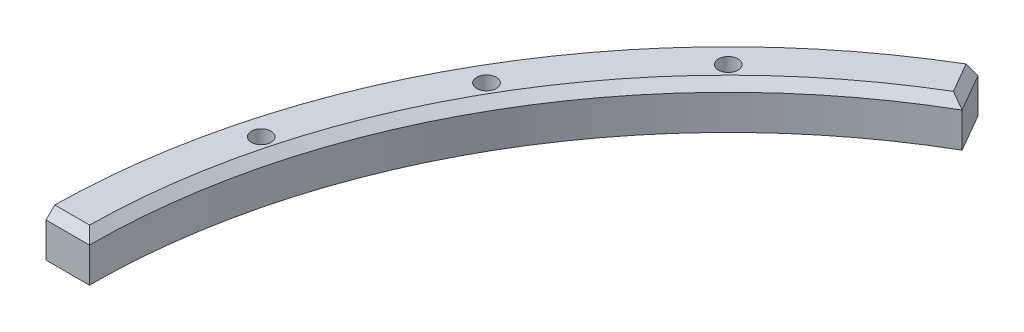
ISO-10303-21;
HEADER;
FILE_DESCRIPTION(('STEP AP214'),'2;1');
FILE_NAME('part.step','',(''),(''),'','','');
FILE_SCHEMA(('AUTOMOTIVE_DESIGN { 1 0 10303 214 1 1 1 1 }'));
ENDSEC;
DATA;
#1=APPLICATION_CONTEXT('core data for automotive mechanical design processes');
#2=APPLICATION_PROTOCOL_DEFINITION('international standard','automotive_design',2000,#1);
#3=PRODUCT_CONTEXT('',#1,'mechanical');
#4=PRODUCT('Part','Part','',(#3));
#5=PRODUCT_RELATED_PRODUCT_CATEGORY('part','',(#4));
#6=PRODUCT_DEFINITION_FORMATION('','',#4);
#7=PRODUCT_DEFINITION_CONTEXT('part definition',#1,'design');
#8=PRODUCT_DEFINITION('design','',#6,#7);
#9=PRODUCT_DEFINITION_SHAPE('','',#8);
#10=(LENGTH_UNIT() NAMED_UNIT(*) SI_UNIT(.MILLI.,.METRE.));
#11=(NAMED_UNIT(*) PLANE_ANGLE_UNIT() SI_UNIT($,.RADIAN.));
#12=(NAMED_UNIT(*) SI_UNIT($,.STERADIAN.) SOLID_ANGLE_UNIT());
#13=UNCERTAINTY_MEASURE_WITH_UNIT(LENGTH_MEASURE(1.E-05),#10,'distance_accuracy_value','');
#14=(GEOMETRIC_REPRESENTATION_CONTEXT(3) GLOBAL_UNCERTAINTY_ASSIGNED_CONTEXT((#13)) GLOBAL_UNIT_ASSIGNED_CONTEXT((#10,
#11,#12)) REPRESENTATION_CONTEXT('',''));
#15=CARTESIAN_POINT('',(0.,0.,0.));
#16=DIRECTION('',(0.,0.,1.));
#17=DIRECTION('',(1.,0.,0.));
#18=AXIS2_PLACEMENT_3D('',#15,#16,#17);
#19=CARTESIAN_POINT('',(0.,10.,0.));
#20=DIRECTION('',(-0.86602540378444,0.,0.499999999999998));
#21=DIRECTION('',(0.499999999999998,0.,0.86602540378444));
#22=AXIS2_PLACEMENT_3D('',#19,#20,#21);
#23=PLANE('',#22);
#24=DIRECTION('',(0.,-1.,0.));
#25=VECTOR('',#24,1.);
#26=CARTESIAN_POINT('',(-78.4999999999997,10.,-135.965988394157));
#27=LINE('',#26,#25);
#28=CARTESIAN_POINT('',(-78.4999999999997,7.99999999999999,-135.965988394157));
#29=VERTEX_POINT('',#28);
#30=CARTESIAN_POINT('',(-78.4999999999997,0.,-135.965988394157));
#31=VERTEX_POINT('',#30);
#32=EDGE_CURVE('E103',#29,#31,#27,.T.);
#33=ORIENTED_EDGE('',*,*,#32,.F.);
#34=DIRECTION('',(0.499999999999998,0.,0.86602540378444));
#35=VECTOR('',#34,1.);
#36=CARTESIAN_POINT('',(-73.4999999999997,7.99999999999999,-127.305734356313));
#37=LINE('',#36,#35);
#38=CARTESIAN_POINT('',(-73.4999999999997,7.99999999999998,-127.305734356313));
#39=VERTEX_POINT('',#38);
#40=EDGE_CURVE('E74',#29,#39,#37,.T.);
#41=ORIENTED_EDGE('',*,*,#40,.T.);
#42=DIRECTION('',(0.,-1.,0.));
#43=VECTOR('',#42,1.);
#44=CARTESIAN_POINT('',(-73.4999999999997,10.,-127.305734356313));
#45=LINE('',#44,#43);
#46=CARTESIAN_POINT('',(-73.4999999999997,0.,-127.305734356313));
#47=VERTEX_POINT('',#46);
#48=EDGE_CURVE('E124',#39,#47,#45,.T.);
#49=ORIENTED_EDGE('',*,*,#48,.T.);
#50=DIRECTION('',(-0.499999999999998,0.,-0.86602540378444));
#51=VECTOR('',#50,1.);
#52=CARTESIAN_POINT('',(0.,0.,0.));
#53=LINE('',#52,#51);
#54=EDGE_CURVE('E119',#47,#31,#53,.T.);
#55=ORIENTED_EDGE('',*,*,#54,.T.);
#56=EDGE_LOOP('',(#33,#41,#49,#55));
#57=FACE_BOUND('',#56,.T.);
#58=ADVANCED_FACE('F43',(#57),#23,.F.);
#59=CARTESIAN_POINT('',(0.,10.,0.));
#60=DIRECTION('',(0.,-1.,0.));
#61=DIRECTION('',(0.,0.,-1.));
#62=AXIS2_PLACEMENT_3D('',#59,#60,#61);
#63=CYLINDRICAL_SURFACE('',#62,157.);
#64=CARTESIAN_POINT('',(0.,10.,0.));
#65=DIRECTION('',(0.,1.,0.));
#66=DIRECTION('',(0.,0.,1.));
#67=AXIS2_PLACEMENT_3D('',#64,#65,#66);
#68=CIRCLE('',#67,157.);
#69=CARTESIAN_POINT('',(-80.225681122391,10.,-134.954955775801));
#70=VERTEX_POINT('',#69);
#71=CARTESIAN_POINT('',(-156.987260629645,10.,-2.00000000000002));
#72=VERTEX_POINT('',#71);
#73=EDGE_CURVE('E131',#70,#72,#68,.T.);
#74=ORIENTED_EDGE('',*,*,#73,.F.);
#75=CARTESIAN_POINT('',(0.,7.99999999999998,0.));
#76=DIRECTION('',(0.612372435695793,0.70710678118655,-0.353553390593271));
#77=DIRECTION('',(0.612372435695797,-0.707106781186545,-0.353553390593274));
#78=AXIS2_PLACEMENT_3D('',#75,#76,#77);
#79=ELLIPSE('',#78,222.031529292575,157.);
#80=EDGE_CURVE('E110',#70,#29,#79,.F.);
#81=ORIENTED_EDGE('',*,*,#80,.T.);
#82=ORIENTED_EDGE('',*,*,#32,.T.);
#83=CARTESIAN_POINT('',(0.,0.,0.));
#84=DIRECTION('',(0.,1.,0.));
#85=DIRECTION('',(0.,0.,1.));
#86=AXIS2_PLACEMENT_3D('',#83,#84,#85);
#87=CIRCLE('',#86,157.);
#88=CARTESIAN_POINT('',(-157.,0.,0.));
#89=VERTEX_POINT('',#88);
#90=EDGE_CURVE('E108',#31,#89,#87,.T.);
#91=ORIENTED_EDGE('',*,*,#90,.T.);
#92=DIRECTION('',(0.,-1.,0.));
#93=VECTOR('',#92,1.);
#94=CARTESIAN_POINT('',(-157.,10.,0.));
#95=LINE('',#94,#93);
#96=CARTESIAN_POINT('',(-157.,7.99999999999998,0.));
#97=VERTEX_POINT('',#96);
#98=EDGE_CURVE('E113',#97,#89,#95,.T.);
#99=ORIENTED_EDGE('',*,*,#98,.F.);
#100=CARTESIAN_POINT('',(0.,7.99999999999998,0.));
#101=DIRECTION('',(0.,-0.707106781186547,-0.707106781186547));
#102=DIRECTION('',(0.,-0.707106781186548,0.707106781186548));
#103=AXIS2_PLACEMENT_3D('',#100,#101,#102);
#104=ELLIPSE('',#103,222.031529292576,157.);
#105=EDGE_CURVE('E147',#97,#72,#104,.T.);
#106=ORIENTED_EDGE('',*,*,#105,.T.);
#107=EDGE_LOOP('',(#74,#81,#82,#91,#99,#106));
#108=FACE_BOUND('',#107,.T.);
#109=ADVANCED_FACE('F106',(#108),#63,.T.);
#110=CARTESIAN_POINT('',(0.,10.,0.));
#111=DIRECTION('',(0.,0.,1.));
#112=DIRECTION('',(1.,0.,0.));
#113=AXIS2_PLACEMENT_3D('',#110,#111,#112);
#114=PLANE('',#113);
#115=DIRECTION('',(0.,-1.,0.));
#116=VECTOR('',#115,1.);
#117=CARTESIAN_POINT('',(-147.,10.,0.));
#118=LINE('',#117,#116);
#119=CARTESIAN_POINT('',(-147.,7.99999999999998,0.));
#120=VERTEX_POINT('',#119);
#121=CARTESIAN_POINT('',(-147.,0.,0.));
#122=VERTEX_POINT('',#121);
#123=EDGE_CURVE('E138',#120,#122,#118,.T.);
#124=ORIENTED_EDGE('',*,*,#123,.F.);
#125=DIRECTION('',(-1.,0.,0.));
#126=VECTOR('',#125,1.);
#127=CARTESIAN_POINT('',(0.,7.99999999999998,0.));
#128=LINE('',#127,#126);
#129=EDGE_CURVE('E11',#120,#97,#128,.T.);
#130=ORIENTED_EDGE('',*,*,#129,.T.);
#131=ORIENTED_EDGE('',*,*,#98,.T.);
#132=DIRECTION('',(-1.,0.,0.));
#133=VECTOR('',#132,1.);
#134=CARTESIAN_POINT('',(0.,0.,0.));
#135=LINE('',#134,#133);
#136=EDGE_CURVE('E122',#122,#89,#135,.T.);
#137=ORIENTED_EDGE('',*,*,#136,.F.);
#138=EDGE_LOOP('',(#124,#130,#131,#137));
#139=FACE_BOUND('',#138,.T.);
#140=ADVANCED_FACE('F177',(#139),#114,.T.);
#141=CARTESIAN_POINT('',(0.,10.,0.));
#142=DIRECTION('',(0.,-1.,0.));
#143=DIRECTION('',(0.,0.,-1.));
#144=AXIS2_PLACEMENT_3D('',#141,#142,#143);
#145=CYLINDRICAL_SURFACE('',#144,147.);
#146=ORIENTED_EDGE('',*,*,#48,.F.);
#147=CARTESIAN_POINT('',(0.,7.99999999999998,0.));
#148=DIRECTION('',(0.,1.,0.));
#149=DIRECTION('',(0.,0.,1.));
#150=AXIS2_PLACEMENT_3D('',#147,#148,#149);
#151=CIRCLE('',#150,147.);
#152=EDGE_CURVE('E59',#39,#120,#151,.T.);
#153=ORIENTED_EDGE('',*,*,#152,.T.);
#154=ORIENTED_EDGE('',*,*,#123,.T.);
#155=CARTESIAN_POINT('',(0.,0.,0.));
#156=DIRECTION('',(0.,1.,0.));
#157=DIRECTION('',(0.,0.,1.));
#158=AXIS2_PLACEMENT_3D('',#155,#156,#157);
#159=CIRCLE('',#158,147.);
#160=EDGE_CURVE('E135',#47,#122,#159,.T.);
#161=ORIENTED_EDGE('',*,*,#160,.F.);
#162=EDGE_LOOP('',(#146,#153,#154,#161));
#163=FACE_BOUND('',#162,.T.);
#164=ADVANCED_FACE('F182',(#163),#145,.F.);
#165=CARTESIAN_POINT('',(0.,10.,0.));
#166=DIRECTION('',(0.,1.,0.));
#167=DIRECTION('',(0.,0.,1.));
#168=AXIS2_PLACEMENT_3D('',#165,#166,#167);
#169=PLANE('',#168);
#170=CARTESIAN_POINT('',(-131.635861375235,10.,-76.0000000000002));
#171=DIRECTION('',(0.,1.,0.));
#172=DIRECTION('',(-0.258819045102521,0.,0.965925826289068));
#173=AXIS2_PLACEMENT_3D('',#170,#171,#172);
#174=CIRCLE('',#173,2.25000000000001);
#175=CARTESIAN_POINT('',(-132.218204226715,10.,-73.8266668908497));
#176=VERTEX_POINT('',#175);
#177=EDGE_CURVE('E213',#176,#176,#174,.T.);
#178=ORIENTED_EDGE('',*,*,#177,.F.);
#179=EDGE_LOOP('',(#178));
#180=FACE_BOUND('',#179,.T.);
#181=CARTESIAN_POINT('',(-107.480230740355,10.,-107.480230740355));
#182=DIRECTION('',(0.,1.,0.));
#183=DIRECTION('',(-0.500000000000001,0.,0.866025403784438));
#184=AXIS2_PLACEMENT_3D('',#181,#182,#183);
#185=CIRCLE('',#184,2.25000000000001);
#186=CARTESIAN_POINT('',(-108.605230740355,10.,-105.53167358184));
#187=VERTEX_POINT('',#186);
#188=EDGE_CURVE('E218',#187,#187,#185,.T.);
#189=ORIENTED_EDGE('',*,*,#188,.F.);
#190=EDGE_LOOP('',(#189));
#191=FACE_BOUND('',#190,.T.);
#192=CARTESIAN_POINT('',(-146.820725595938,10.,-39.3404948555832));
#193=DIRECTION('',(0.,1.,0.));
#194=DIRECTION('',(0.,0.,1.));
#195=AXIS2_PLACEMENT_3D('',#192,#193,#194);
#196=CIRCLE('',#195,2.25000000000001);
#197=CARTESIAN_POINT('',(-146.820725595938,10.,-37.0904948555832));
#198=VERTEX_POINT('',#197);
#199=EDGE_CURVE('E128',#198,#198,#196,.T.);
#200=ORIENTED_EDGE('',*,*,#199,.F.);
#201=EDGE_LOOP('',(#200));
#202=FACE_BOUND('',#201,.T.);
#203=CARTESIAN_POINT('',(0.,10.,0.));
#204=DIRECTION('',(0.,1.,0.));
#205=DIRECTION('',(0.,0.,1.));
#206=AXIS2_PLACEMENT_3D('',#203,#204,#205);
#207=CIRCLE('',#206,149.);
#208=CARTESIAN_POINT('',(-148.986576576549,10.,-2.00000000000002));
#209=VERTEX_POINT('',#208);
#210=CARTESIAN_POINT('',(-76.2253390958433,10.,-128.026160138167));
#211=VERTEX_POINT('',#210);
#212=EDGE_CURVE('E142',#209,#211,#207,.F.);
#213=ORIENTED_EDGE('',*,*,#212,.T.);
#214=DIRECTION('',(-0.499999999999998,0.,-0.86602540378444));
#215=VECTOR('',#214,1.);
#216=CARTESIAN_POINT('',(-80.2320508075686,10.,-134.965988394157));
#217=LINE('',#216,#215);
#218=EDGE_CURVE('E144',#211,#70,#217,.T.);
#219=ORIENTED_EDGE('',*,*,#218,.T.);
#220=ORIENTED_EDGE('',*,*,#73,.T.);
#221=DIRECTION('',(1.,0.,0.));
#222=VECTOR('',#221,1.);
#223=CARTESIAN_POINT('',(0.,10.,-2.00000000000002));
#224=LINE('',#223,#222);
#225=EDGE_CURVE('E112',#72,#209,#224,.T.);
#226=ORIENTED_EDGE('',*,*,#225,.T.);
#227=EDGE_LOOP('',(#213,#219,#220,#226));
#228=FACE_BOUND('',#227,.T.);
#229=ADVANCED_FACE('F186',(#180,#191,#202,#228),#169,.T.);
#230=CARTESIAN_POINT('',(0.,0.,0.));
#231=DIRECTION('',(0.,1.,0.));
#232=DIRECTION('',(0.,0.,1.));
#233=AXIS2_PLACEMENT_3D('',#230,#231,#232);
#234=PLANE('',#233);
#235=CARTESIAN_POINT('',(-131.635861375235,0.,-76.0000000000002));
#236=DIRECTION('',(0.,1.,0.));
#237=DIRECTION('',(-0.258819045102521,0.,0.965925826289068));
#238=AXIS2_PLACEMENT_3D('',#235,#236,#237);
#239=CIRCLE('',#238,2.25000000000001);
#240=CARTESIAN_POINT('',(-132.218204226715,0.,-73.8266668908497));
#241=VERTEX_POINT('',#240);
#242=EDGE_CURVE('E210',#241,#241,#239,.T.);
#243=ORIENTED_EDGE('',*,*,#242,.T.);
#244=EDGE_LOOP('',(#243));
#245=FACE_BOUND('',#244,.T.);
#246=CARTESIAN_POINT('',(-107.480230740355,0.,-107.480230740355));
#247=DIRECTION('',(0.,1.,0.));
#248=DIRECTION('',(-0.500000000000001,0.,0.866025403784438));
#249=AXIS2_PLACEMENT_3D('',#246,#247,#248);
#250=CIRCLE('',#249,2.25000000000001);
#251=CARTESIAN_POINT('',(-108.605230740355,0.,-105.53167358184));
#252=VERTEX_POINT('',#251);
#253=EDGE_CURVE('E214',#252,#252,#250,.T.);
#254=ORIENTED_EDGE('',*,*,#253,.T.);
#255=EDGE_LOOP('',(#254));
#256=FACE_BOUND('',#255,.T.);
#257=CARTESIAN_POINT('',(-146.820725595938,0.,-39.3404948555832));
#258=DIRECTION('',(0.,1.,0.));
#259=DIRECTION('',(0.,0.,1.));
#260=AXIS2_PLACEMENT_3D('',#257,#258,#259);
#261=CIRCLE('',#260,2.25000000000001);
#262=CARTESIAN_POINT('',(-146.820725595938,0.,-37.0904948555832));
#263=VERTEX_POINT('',#262);
#264=EDGE_CURVE('E125',#263,#263,#261,.T.);
#265=ORIENTED_EDGE('',*,*,#264,.T.);
#266=EDGE_LOOP('',(#265));
#267=FACE_BOUND('',#266,.T.);
#268=ORIENTED_EDGE('',*,*,#54,.F.);
#269=ORIENTED_EDGE('',*,*,#160,.T.);
#270=ORIENTED_EDGE('',*,*,#136,.T.);
#271=ORIENTED_EDGE('',*,*,#90,.F.);
#272=EDGE_LOOP('',(#268,#269,#270,#271));
#273=FACE_BOUND('',#272,.T.);
#274=ADVANCED_FACE('F117',(#245,#256,#267,#273),#234,.F.);
#275=CARTESIAN_POINT('',(-146.820725595938,0.,-39.3404948555832));
#276=DIRECTION('',(0.,1.,0.));
#277=DIRECTION('',(0.,0.,1.));
#278=AXIS2_PLACEMENT_3D('',#275,#276,#277);
#279=CYLINDRICAL_SURFACE('',#278,2.25000000000001);
#280=ORIENTED_EDGE('',*,*,#264,.F.);
#281=EDGE_LOOP('',(#280));
#282=FACE_BOUND('',#281,.T.);
#283=ORIENTED_EDGE('',*,*,#199,.T.);
#284=EDGE_LOOP('',(#283));
#285=FACE_BOUND('',#284,.T.);
#286=ADVANCED_FACE('F189',(#282,#285),#279,.F.);
#287=CARTESIAN_POINT('',(-107.480230740355,0.,-107.480230740355));
#288=DIRECTION('',(0.,1.,0.));
#289=DIRECTION('',(0.,0.,1.));
#290=AXIS2_PLACEMENT_3D('',#287,#288,#289);
#291=CYLINDRICAL_SURFACE('',#290,2.25000000000001);
#292=ORIENTED_EDGE('',*,*,#253,.F.);
#293=EDGE_LOOP('',(#292));
#294=FACE_BOUND('',#293,.T.);
#295=ORIENTED_EDGE('',*,*,#188,.T.);
#296=EDGE_LOOP('',(#295));
#297=FACE_BOUND('',#296,.T.);
#298=ADVANCED_FACE('F196',(#294,#297),#291,.F.);
#299=CARTESIAN_POINT('',(-131.635861375235,0.,-76.0000000000002));
#300=DIRECTION('',(0.,1.,0.));
#301=DIRECTION('',(0.,0.,1.));
#302=AXIS2_PLACEMENT_3D('',#299,#300,#301);
#303=CYLINDRICAL_SURFACE('',#302,2.25000000000001);
#304=ORIENTED_EDGE('',*,*,#242,.F.);
#305=EDGE_LOOP('',(#304));
#306=FACE_BOUND('',#305,.T.);
#307=ORIENTED_EDGE('',*,*,#177,.T.);
#308=EDGE_LOOP('',(#307));
#309=FACE_BOUND('',#308,.T.);
#310=ADVANCED_FACE('F200',(#306,#309),#303,.F.);
#311=CARTESIAN_POINT('',(0.,7.99999999999998,0.));
#312=DIRECTION('',(0.,-0.707106781186547,-0.707106781186547));
#313=DIRECTION('',(-1.,0.,0.));
#314=AXIS2_PLACEMENT_3D('',#311,#312,#313);
#315=PLANE('',#314);
#316=ORIENTED_EDGE('',*,*,#105,.F.);
#317=ORIENTED_EDGE('',*,*,#129,.F.);
#318=CARTESIAN_POINT('',(-147.,7.99999999999998,0.));
#319=CARTESIAN_POINT('',(-147.332584211406,8.33259427795586,-0.332594277955878));
#320=CARTESIAN_POINT('',(-147.664424367929,8.66555808641224,-0.665558086412259));
#321=CARTESIAN_POINT('',(-148.326616560062,9.33222475310379,-1.33222475310381));
#322=CARTESIAN_POINT('',(-148.656968595722,9.66592761131408,-1.6659276113141));
#323=CARTESIAN_POINT('',(-148.986576576549,9.99999999999999,-2.));
#324=B_SPLINE_CURVE_WITH_KNOTS('',3,(#318,#319,#320,#321,#322,#323),.UNSPECIFIED.,.F.,.F.,(4,2,
4),(0.,1.72818666951295,3.45637328084362),.UNSPECIFIED.);
#325=EDGE_CURVE('E49',#209,#120,#324,.F.);
#326=ORIENTED_EDGE('',*,*,#325,.F.);
#327=ORIENTED_EDGE('',*,*,#225,.F.);
#328=EDGE_LOOP('',(#316,#317,#326,#327));
#329=FACE_BOUND('',#328,.T.);
#330=ADVANCED_FACE('F46',(#329),#315,.F.);
#331=CARTESIAN_POINT('',(0.,7.99999999999998,0.));
#332=DIRECTION('',(0.,1.,0.));
#333=DIRECTION('',(0.,0.,1.));
#334=AXIS2_PLACEMENT_3D('',#331,#332,#333);
#335=CONICAL_SURFACE('',#334,147.,0.785398163397452);
#336=ORIENTED_EDGE('',*,*,#325,.T.);
#337=ORIENTED_EDGE('',*,*,#152,.F.);
#338=CARTESIAN_POINT('',(-73.4999999999997,7.99999999999998,-127.305734356313));
#339=CARTESIAN_POINT('',(-73.9543271995658,8.33259427795586,-127.42746359331));
#340=CARTESIAN_POINT('',(-74.4086023944913,8.66555808641224,-127.548363694626));
#341=CARTESIAN_POINT('',(-75.3170487597689,9.33222475310379,-127.788505621855));
#342=CARTESIAN_POINT('',(-75.7712199301246,9.66592761131407,-127.907747447824));
#343=CARTESIAN_POINT('',(-76.2253390958433,9.99999999999998,-128.026160138168));
#344=B_SPLINE_CURVE_WITH_KNOTS('',3,(#338,#339,#340,#341,#342,#343),.UNSPECIFIED.,.F.,.F.,(4,2,
4),(0.,1.72818666951295,3.45637328084362),.UNSPECIFIED.);
#345=EDGE_CURVE('E151',#211,#39,#344,.F.);
#346=ORIENTED_EDGE('',*,*,#345,.F.);
#347=ORIENTED_EDGE('',*,*,#212,.F.);
#348=EDGE_LOOP('',(#336,#337,#346,#347));
#349=FACE_BOUND('',#348,.T.);
#350=ADVANCED_FACE('F158',(#349),#335,.F.);
#351=CARTESIAN_POINT('',(-1.73205080756891,10.,1.00000000000001));
#352=DIRECTION('',(0.612372435695793,0.70710678118655,-0.353553390593271));
#353=DIRECTION('',(0.499999999999998,0.,0.86602540378444));
#354=AXIS2_PLACEMENT_3D('',#351,#352,#353);
#355=PLANE('',#354);
#356=ORIENTED_EDGE('',*,*,#345,.T.);
#357=ORIENTED_EDGE('',*,*,#40,.F.);
#358=ORIENTED_EDGE('',*,*,#80,.F.);
#359=ORIENTED_EDGE('',*,*,#218,.F.);
#360=EDGE_LOOP('',(#356,#357,#358,#359));
#361=FACE_BOUND('',#360,.T.);
#362=ADVANCED_FACE('F162',(#361),#355,.T.);
#363=CLOSED_SHELL('',(#58,#109,#140,#164,#229,#274,#286,#298,#310,#330,#350,#362));
#364=MANIFOLD_SOLID_BREP('B2',#363);
#365=ADVANCED_BREP_SHAPE_REPRESENTATION('',(#18,#364),#14);
#366=SHAPE_DEFINITION_REPRESENTATION(#9,#365);
ENDSEC;
END-ISO-10303-21;
